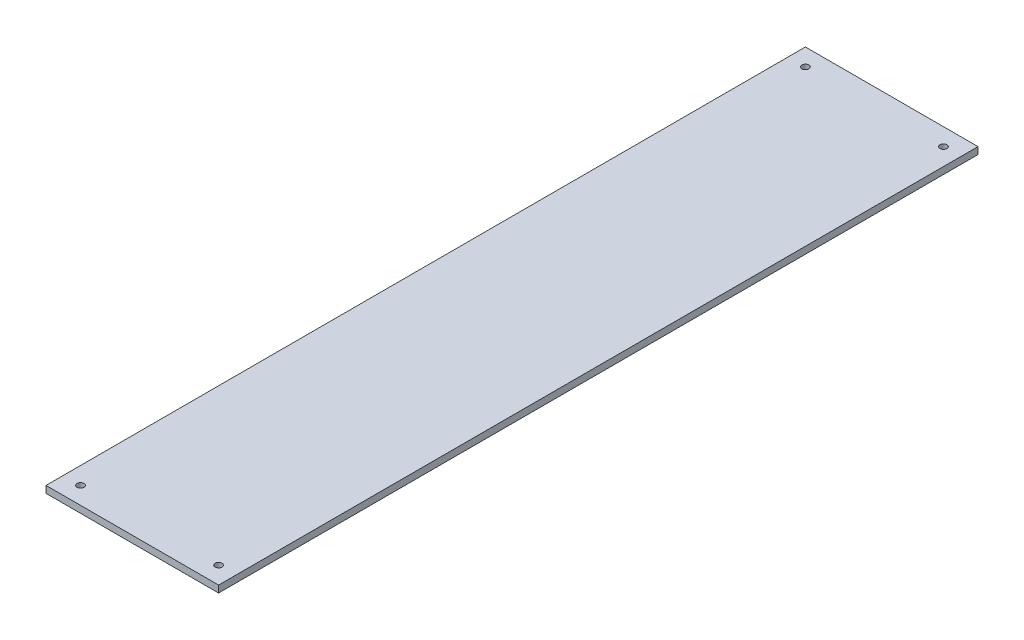
ISO-10303-21;
HEADER;
FILE_DESCRIPTION(('STEP AP214'),'2;1');
FILE_NAME('part.step','',(''),(''),'','','');
FILE_SCHEMA(('AUTOMOTIVE_DESIGN { 1 0 10303 214 1 1 1 1 }'));
ENDSEC;
DATA;
#1=APPLICATION_CONTEXT('core data for automotive mechanical design processes');
#2=APPLICATION_PROTOCOL_DEFINITION('international standard','automotive_design',2000,#1);
#3=PRODUCT_CONTEXT('',#1,'mechanical');
#4=PRODUCT('Part','Part','',(#3));
#5=PRODUCT_RELATED_PRODUCT_CATEGORY('part','',(#4));
#6=PRODUCT_DEFINITION_FORMATION('','',#4);
#7=PRODUCT_DEFINITION_CONTEXT('part definition',#1,'design');
#8=PRODUCT_DEFINITION('design','',#6,#7);
#9=PRODUCT_DEFINITION_SHAPE('','',#8);
#10=(LENGTH_UNIT() NAMED_UNIT(*) SI_UNIT(.MILLI.,.METRE.));
#11=(NAMED_UNIT(*) PLANE_ANGLE_UNIT() SI_UNIT($,.RADIAN.));
#12=(NAMED_UNIT(*) SI_UNIT($,.STERADIAN.) SOLID_ANGLE_UNIT());
#13=UNCERTAINTY_MEASURE_WITH_UNIT(LENGTH_MEASURE(1.E-05),#10,'distance_accuracy_value','');
#14=(GEOMETRIC_REPRESENTATION_CONTEXT(3) GLOBAL_UNCERTAINTY_ASSIGNED_CONTEXT((#13)) GLOBAL_UNIT_ASSIGNED_CONTEXT((#10,
#11,#12)) REPRESENTATION_CONTEXT('',''));
#15=CARTESIAN_POINT('',(0.,0.,0.));
#16=DIRECTION('',(0.,0.,1.));
#17=DIRECTION('',(1.,0.,0.));
#18=AXIS2_PLACEMENT_3D('',#15,#16,#17);
#19=CARTESIAN_POINT('',(125.,10.,550.));
#20=DIRECTION('',(-1.,0.,0.));
#21=DIRECTION('',(0.,0.,1.));
#22=AXIS2_PLACEMENT_3D('',#19,#20,#21);
#23=PLANE('',#22);
#24=DIRECTION('',(0.,0.,-1.));
#25=VECTOR('',#24,1.);
#26=CARTESIAN_POINT('',(125.,0.,550.));
#27=LINE('',#26,#25);
#28=CARTESIAN_POINT('',(125.,0.,550.));
#29=VERTEX_POINT('',#28);
#30=CARTESIAN_POINT('',(125.,0.,-550.));
#31=VERTEX_POINT('',#30);
#32=EDGE_CURVE('E95',#29,#31,#27,.T.);
#33=ORIENTED_EDGE('',*,*,#32,.T.);
#34=DIRECTION('',(0.,-1.,0.));
#35=VECTOR('',#34,1.);
#36=CARTESIAN_POINT('',(125.,10.,-550.));
#37=LINE('',#36,#35);
#38=CARTESIAN_POINT('',(125.,10.,-550.));
#39=VERTEX_POINT('',#38);
#40=EDGE_CURVE('E11',#39,#31,#37,.T.);
#41=ORIENTED_EDGE('',*,*,#40,.F.);
#42=DIRECTION('',(0.,0.,-1.));
#43=VECTOR('',#42,1.);
#44=CARTESIAN_POINT('',(125.,10.,550.));
#45=LINE('',#44,#43);
#46=CARTESIAN_POINT('',(125.,10.,550.));
#47=VERTEX_POINT('',#46);
#48=EDGE_CURVE('E83',#47,#39,#45,.T.);
#49=ORIENTED_EDGE('',*,*,#48,.F.);
#50=DIRECTION('',(0.,-1.,0.));
#51=VECTOR('',#50,1.);
#52=CARTESIAN_POINT('',(125.,10.,550.));
#53=LINE('',#52,#51);
#54=EDGE_CURVE('E91',#47,#29,#53,.T.);
#55=ORIENTED_EDGE('',*,*,#54,.T.);
#56=EDGE_LOOP('',(#33,#41,#49,#55));
#57=FACE_BOUND('',#56,.T.);
#58=ADVANCED_FACE('F32',(#57),#23,.F.);
#59=CARTESIAN_POINT('',(-125.,10.,-550.));
#60=DIRECTION('',(0.,0.,1.));
#61=DIRECTION('',(1.,0.,0.));
#62=AXIS2_PLACEMENT_3D('',#59,#60,#61);
#63=PLANE('',#62);
#64=DIRECTION('',(-1.,0.,0.));
#65=VECTOR('',#64,1.);
#66=CARTESIAN_POINT('',(-125.,0.,-550.));
#67=LINE('',#66,#65);
#68=CARTESIAN_POINT('',(-125.,0.,-550.));
#69=VERTEX_POINT('',#68);
#70=EDGE_CURVE('E87',#31,#69,#67,.T.);
#71=ORIENTED_EDGE('',*,*,#70,.T.);
#72=DIRECTION('',(0.,-1.,0.));
#73=VECTOR('',#72,1.);
#74=CARTESIAN_POINT('',(-125.,10.,-550.));
#75=LINE('',#74,#73);
#76=CARTESIAN_POINT('',(-125.,10.,-550.));
#77=VERTEX_POINT('',#76);
#78=EDGE_CURVE('E40',#77,#69,#75,.T.);
#79=ORIENTED_EDGE('',*,*,#78,.F.);
#80=DIRECTION('',(-1.,0.,0.));
#81=VECTOR('',#80,1.);
#82=CARTESIAN_POINT('',(-125.,10.,-550.));
#83=LINE('',#82,#81);
#84=EDGE_CURVE('E78',#39,#77,#83,.T.);
#85=ORIENTED_EDGE('',*,*,#84,.F.);
#86=ORIENTED_EDGE('',*,*,#40,.T.);
#87=EDGE_LOOP('',(#71,#79,#85,#86));
#88=FACE_BOUND('',#87,.T.);
#89=ADVANCED_FACE('F86',(#88),#63,.F.);
#90=CARTESIAN_POINT('',(-125.,10.,550.));
#91=DIRECTION('',(1.,0.,0.));
#92=DIRECTION('',(0.,0.,-1.));
#93=AXIS2_PLACEMENT_3D('',#90,#91,#92);
#94=PLANE('',#93);
#95=DIRECTION('',(0.,0.,1.));
#96=VECTOR('',#95,1.);
#97=CARTESIAN_POINT('',(-125.,0.,550.));
#98=LINE('',#97,#96);
#99=CARTESIAN_POINT('',(-125.,0.,550.));
#100=VERTEX_POINT('',#99);
#101=EDGE_CURVE('E65',#69,#100,#98,.T.);
#102=ORIENTED_EDGE('',*,*,#101,.T.);
#103=DIRECTION('',(0.,-1.,0.));
#104=VECTOR('',#103,1.);
#105=CARTESIAN_POINT('',(-125.,10.,550.));
#106=LINE('',#105,#104);
#107=CARTESIAN_POINT('',(-125.,10.,550.));
#108=VERTEX_POINT('',#107);
#109=EDGE_CURVE('E88',#108,#100,#106,.T.);
#110=ORIENTED_EDGE('',*,*,#109,.F.);
#111=DIRECTION('',(0.,0.,1.));
#112=VECTOR('',#111,1.);
#113=CARTESIAN_POINT('',(-125.,10.,550.));
#114=LINE('',#113,#112);
#115=EDGE_CURVE('E81',#77,#108,#114,.T.);
#116=ORIENTED_EDGE('',*,*,#115,.F.);
#117=ORIENTED_EDGE('',*,*,#78,.T.);
#118=EDGE_LOOP('',(#102,#110,#116,#117));
#119=FACE_BOUND('',#118,.T.);
#120=ADVANCED_FACE('F89',(#119),#94,.F.);
#121=CARTESIAN_POINT('',(-125.,10.,550.));
#122=DIRECTION('',(0.,0.,-1.));
#123=DIRECTION('',(-1.,0.,0.));
#124=AXIS2_PLACEMENT_3D('',#121,#122,#123);
#125=PLANE('',#124);
#126=DIRECTION('',(1.,0.,0.));
#127=VECTOR('',#126,1.);
#128=CARTESIAN_POINT('',(-125.,0.,550.));
#129=LINE('',#128,#127);
#130=EDGE_CURVE('E71',#100,#29,#129,.T.);
#131=ORIENTED_EDGE('',*,*,#130,.T.);
#132=ORIENTED_EDGE('',*,*,#54,.F.);
#133=DIRECTION('',(1.,0.,0.));
#134=VECTOR('',#133,1.);
#135=CARTESIAN_POINT('',(-125.,10.,550.));
#136=LINE('',#135,#134);
#137=EDGE_CURVE('E48',#108,#47,#136,.T.);
#138=ORIENTED_EDGE('',*,*,#137,.F.);
#139=ORIENTED_EDGE('',*,*,#109,.T.);
#140=EDGE_LOOP('',(#131,#132,#138,#139));
#141=FACE_BOUND('',#140,.T.);
#142=ADVANCED_FACE('F103',(#141),#125,.F.);
#143=CARTESIAN_POINT('',(0.,10.,0.));
#144=DIRECTION('',(0.,-1.,0.));
#145=DIRECTION('',(0.,0.,-1.));
#146=AXIS2_PLACEMENT_3D('',#143,#144,#145);
#147=PLANE('',#146);
#148=CARTESIAN_POINT('',(-100.,10.,-525.));
#149=DIRECTION('',(0.,1.,0.));
#150=DIRECTION('',(0.,0.,1.));
#151=AXIS2_PLACEMENT_3D('',#148,#149,#150);
#152=CIRCLE('',#151,5.00000000000001);
#153=CARTESIAN_POINT('',(-100.,10.,-520.));
#154=VERTEX_POINT('',#153);
#155=EDGE_CURVE('E122',#154,#154,#152,.T.);
#156=ORIENTED_EDGE('',*,*,#155,.F.);
#157=EDGE_LOOP('',(#156));
#158=FACE_BOUND('',#157,.T.);
#159=CARTESIAN_POINT('',(99.9999999999999,10.,525.));
#160=DIRECTION('',(0.,1.,0.));
#161=DIRECTION('',(0.,0.,1.));
#162=AXIS2_PLACEMENT_3D('',#159,#160,#161);
#163=CIRCLE('',#162,5.00000000000001);
#164=CARTESIAN_POINT('',(99.9999999999999,10.,530.));
#165=VERTEX_POINT('',#164);
#166=EDGE_CURVE('E115',#165,#165,#163,.T.);
#167=ORIENTED_EDGE('',*,*,#166,.F.);
#168=EDGE_LOOP('',(#167));
#169=FACE_BOUND('',#168,.T.);
#170=CARTESIAN_POINT('',(-99.9999999999999,10.,525.));
#171=DIRECTION('',(0.,1.,0.));
#172=DIRECTION('',(0.,0.,1.));
#173=AXIS2_PLACEMENT_3D('',#170,#171,#172);
#174=CIRCLE('',#173,5.00000000000001);
#175=CARTESIAN_POINT('',(-99.9999999999999,10.,530.));
#176=VERTEX_POINT('',#175);
#177=EDGE_CURVE('E127',#176,#176,#174,.T.);
#178=ORIENTED_EDGE('',*,*,#177,.F.);
#179=EDGE_LOOP('',(#178));
#180=FACE_BOUND('',#179,.T.);
#181=CARTESIAN_POINT('',(99.9999999999999,10.,-525.));
#182=DIRECTION('',(0.,1.,0.));
#183=DIRECTION('',(0.,0.,1.));
#184=AXIS2_PLACEMENT_3D('',#181,#182,#183);
#185=CIRCLE('',#184,5.00000000000001);
#186=CARTESIAN_POINT('',(99.9999999999999,10.,-520.));
#187=VERTEX_POINT('',#186);
#188=EDGE_CURVE('E109',#187,#187,#185,.T.);
#189=ORIENTED_EDGE('',*,*,#188,.F.);
#190=EDGE_LOOP('',(#189));
#191=FACE_BOUND('',#190,.T.);
#192=ORIENTED_EDGE('',*,*,#48,.T.);
#193=ORIENTED_EDGE('',*,*,#84,.T.);
#194=ORIENTED_EDGE('',*,*,#115,.T.);
#195=ORIENTED_EDGE('',*,*,#137,.T.);
#196=EDGE_LOOP('',(#192,#193,#194,#195));
#197=FACE_BOUND('',#196,.T.);
#198=ADVANCED_FACE('F79',(#158,#169,#180,#191,#197),#147,.F.);
#199=CARTESIAN_POINT('',(0.,0.,0.));
#200=DIRECTION('',(0.,-1.,0.));
#201=DIRECTION('',(0.,0.,-1.));
#202=AXIS2_PLACEMENT_3D('',#199,#200,#201);
#203=PLANE('',#202);
#204=CARTESIAN_POINT('',(-100.,0.,-525.));
#205=DIRECTION('',(0.,1.,0.));
#206=DIRECTION('',(0.,0.,1.));
#207=AXIS2_PLACEMENT_3D('',#204,#205,#206);
#208=CIRCLE('',#207,5.00000000000001);
#209=CARTESIAN_POINT('',(-100.,0.,-520.));
#210=VERTEX_POINT('',#209);
#211=EDGE_CURVE('E112',#210,#210,#208,.T.);
#212=ORIENTED_EDGE('',*,*,#211,.T.);
#213=EDGE_LOOP('',(#212));
#214=FACE_BOUND('',#213,.T.);
#215=CARTESIAN_POINT('',(99.9999999999999,0.,525.));
#216=DIRECTION('',(0.,1.,0.));
#217=DIRECTION('',(0.,0.,1.));
#218=AXIS2_PLACEMENT_3D('',#215,#216,#217);
#219=CIRCLE('',#218,5.00000000000001);
#220=CARTESIAN_POINT('',(99.9999999999999,0.,530.));
#221=VERTEX_POINT('',#220);
#222=EDGE_CURVE('E118',#221,#221,#219,.T.);
#223=ORIENTED_EDGE('',*,*,#222,.T.);
#224=EDGE_LOOP('',(#223));
#225=FACE_BOUND('',#224,.T.);
#226=CARTESIAN_POINT('',(-99.9999999999999,0.,525.));
#227=DIRECTION('',(0.,1.,0.));
#228=DIRECTION('',(0.,0.,1.));
#229=AXIS2_PLACEMENT_3D('',#226,#227,#228);
#230=CIRCLE('',#229,5.00000000000001);
#231=CARTESIAN_POINT('',(-99.9999999999999,0.,530.));
#232=VERTEX_POINT('',#231);
#233=EDGE_CURVE('E119',#232,#232,#230,.T.);
#234=ORIENTED_EDGE('',*,*,#233,.T.);
#235=EDGE_LOOP('',(#234));
#236=FACE_BOUND('',#235,.T.);
#237=CARTESIAN_POINT('',(99.9999999999999,0.,-525.));
#238=DIRECTION('',(0.,1.,0.));
#239=DIRECTION('',(0.,0.,1.));
#240=AXIS2_PLACEMENT_3D('',#237,#238,#239);
#241=CIRCLE('',#240,5.00000000000001);
#242=CARTESIAN_POINT('',(99.9999999999999,0.,-520.));
#243=VERTEX_POINT('',#242);
#244=EDGE_CURVE('E98',#243,#243,#241,.T.);
#245=ORIENTED_EDGE('',*,*,#244,.T.);
#246=EDGE_LOOP('',(#245));
#247=FACE_BOUND('',#246,.T.);
#248=ORIENTED_EDGE('',*,*,#32,.F.);
#249=ORIENTED_EDGE('',*,*,#130,.F.);
#250=ORIENTED_EDGE('',*,*,#101,.F.);
#251=ORIENTED_EDGE('',*,*,#70,.F.);
#252=EDGE_LOOP('',(#248,#249,#250,#251));
#253=FACE_BOUND('',#252,.T.);
#254=ADVANCED_FACE('F106',(#214,#225,#236,#247,#253),#203,.T.);
#255=CARTESIAN_POINT('',(99.9999999999999,0.,-525.));
#256=DIRECTION('',(0.,1.,0.));
#257=DIRECTION('',(0.,0.,1.));
#258=AXIS2_PLACEMENT_3D('',#255,#256,#257);
#259=CYLINDRICAL_SURFACE('',#258,5.00000000000001);
#260=ORIENTED_EDGE('',*,*,#244,.F.);
#261=EDGE_LOOP('',(#260));
#262=FACE_BOUND('',#261,.T.);
#263=ORIENTED_EDGE('',*,*,#188,.T.);
#264=EDGE_LOOP('',(#263));
#265=FACE_BOUND('',#264,.T.);
#266=ADVANCED_FACE('F139',(#262,#265),#259,.F.);
#267=CARTESIAN_POINT('',(-99.9999999999999,0.,525.));
#268=DIRECTION('',(0.,1.,0.));
#269=DIRECTION('',(0.,0.,1.));
#270=AXIS2_PLACEMENT_3D('',#267,#268,#269);
#271=CYLINDRICAL_SURFACE('',#270,5.00000000000001);
#272=ORIENTED_EDGE('',*,*,#233,.F.);
#273=EDGE_LOOP('',(#272));
#274=FACE_BOUND('',#273,.T.);
#275=ORIENTED_EDGE('',*,*,#177,.T.);
#276=EDGE_LOOP('',(#275));
#277=FACE_BOUND('',#276,.T.);
#278=ADVANCED_FACE('F135',(#274,#277),#271,.F.);
#279=CARTESIAN_POINT('',(99.9999999999999,0.,525.));
#280=DIRECTION('',(0.,1.,0.));
#281=DIRECTION('',(0.,0.,1.));
#282=AXIS2_PLACEMENT_3D('',#279,#280,#281);
#283=CYLINDRICAL_SURFACE('',#282,5.00000000000001);
#284=ORIENTED_EDGE('',*,*,#222,.F.);
#285=EDGE_LOOP('',(#284));
#286=FACE_BOUND('',#285,.T.);
#287=ORIENTED_EDGE('',*,*,#166,.T.);
#288=EDGE_LOOP('',(#287));
#289=FACE_BOUND('',#288,.T.);
#290=ADVANCED_FACE('F138',(#286,#289),#283,.F.);
#291=CARTESIAN_POINT('',(-100.,0.,-525.));
#292=DIRECTION('',(0.,1.,0.));
#293=DIRECTION('',(0.,0.,1.));
#294=AXIS2_PLACEMENT_3D('',#291,#292,#293);
#295=CYLINDRICAL_SURFACE('',#294,5.00000000000001);
#296=ORIENTED_EDGE('',*,*,#211,.F.);
#297=EDGE_LOOP('',(#296));
#298=FACE_BOUND('',#297,.T.);
#299=ORIENTED_EDGE('',*,*,#155,.T.);
#300=EDGE_LOOP('',(#299));
#301=FACE_BOUND('',#300,.T.);
#302=ADVANCED_FACE('F200',(#298,#301),#295,.F.);
#303=CLOSED_SHELL('',(#58,#89,#120,#142,#198,#254,#266,#278,#290,#302));
#304=MANIFOLD_SOLID_BREP('B2',#303);
#305=ADVANCED_BREP_SHAPE_REPRESENTATION('',(#18,#304),#14);
#306=SHAPE_DEFINITION_REPRESENTATION(#9,#305);
ENDSEC;
END-ISO-10303-21;
